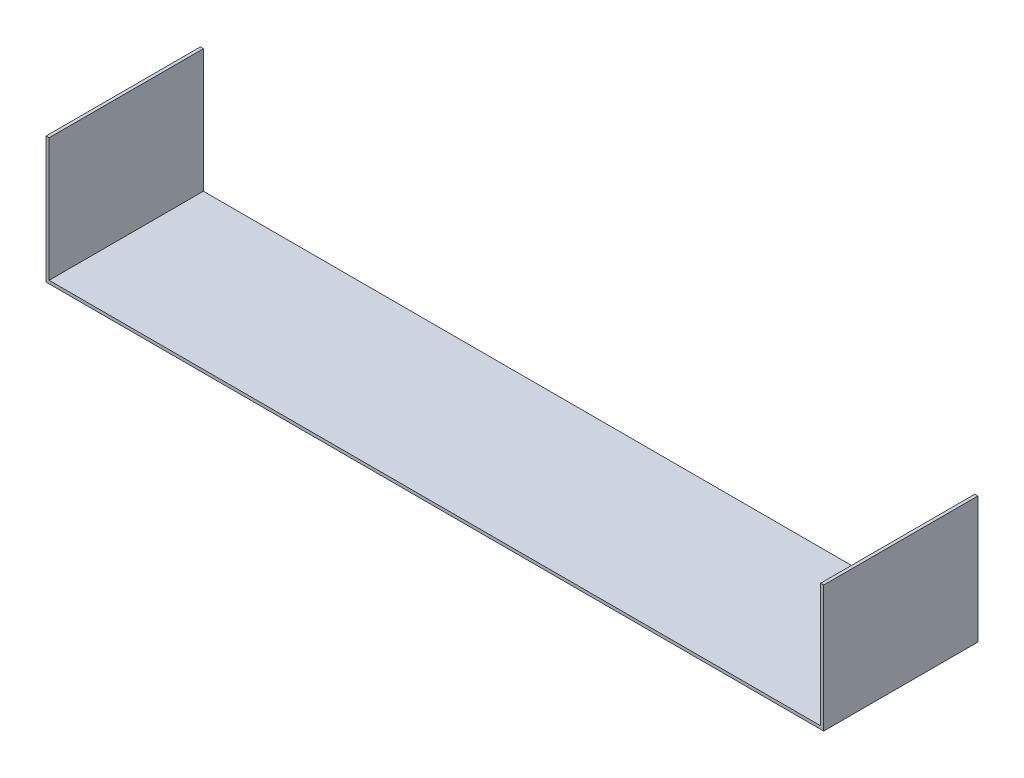
ISO-10303-21;
HEADER;
FILE_DESCRIPTION(('STEP AP214'),'2;1');
FILE_NAME('part.step','',(''),(''),'','','');
FILE_SCHEMA(('AUTOMOTIVE_DESIGN { 1 0 10303 214 1 1 1 1 }'));
ENDSEC;
DATA;
#1=APPLICATION_CONTEXT('core data for automotive mechanical design processes');
#2=APPLICATION_PROTOCOL_DEFINITION('international standard','automotive_design',2000,#1);
#3=PRODUCT_CONTEXT('',#1,'mechanical');
#4=PRODUCT('Part','Part','',(#3));
#5=PRODUCT_RELATED_PRODUCT_CATEGORY('part','',(#4));
#6=PRODUCT_DEFINITION_FORMATION('','',#4);
#7=PRODUCT_DEFINITION_CONTEXT('part definition',#1,'design');
#8=PRODUCT_DEFINITION('design','',#6,#7);
#9=PRODUCT_DEFINITION_SHAPE('','',#8);
#10=(LENGTH_UNIT() NAMED_UNIT(*) SI_UNIT(.MILLI.,.METRE.));
#11=(NAMED_UNIT(*) PLANE_ANGLE_UNIT() SI_UNIT($,.RADIAN.));
#12=(NAMED_UNIT(*) SI_UNIT($,.STERADIAN.) SOLID_ANGLE_UNIT());
#13=UNCERTAINTY_MEASURE_WITH_UNIT(LENGTH_MEASURE(1.E-05),#10,'distance_accuracy_value','');
#14=(GEOMETRIC_REPRESENTATION_CONTEXT(3) GLOBAL_UNCERTAINTY_ASSIGNED_CONTEXT((#13)) GLOBAL_UNIT_ASSIGNED_CONTEXT((#10,
#11,#12)) REPRESENTATION_CONTEXT('',''));
#15=CARTESIAN_POINT('',(0.,0.,0.));
#16=DIRECTION('',(0.,0.,1.));
#17=DIRECTION('',(1.,0.,0.));
#18=AXIS2_PLACEMENT_3D('',#15,#16,#17);
#19=CARTESIAN_POINT('',(-200.,0.,-10000.));
#20=DIRECTION('',(0.,1.,0.));
#21=DIRECTION('',(0.,0.,1.));
#22=AXIS2_PLACEMENT_3D('',#19,#20,#21);
#23=PLANE('',#22);
#24=DIRECTION('',(-1.,0.,0.));
#25=VECTOR('',#24,1.);
#26=CARTESIAN_POINT('',(-200.,0.,0.));
#27=LINE('',#26,#25);
#28=CARTESIAN_POINT('',(0.,0.,0.));
#29=VERTEX_POINT('',#28);
#30=CARTESIAN_POINT('',(-200.,0.,0.));
#31=VERTEX_POINT('',#30);
#32=EDGE_CURVE('E138',#29,#31,#27,.T.);
#33=ORIENTED_EDGE('',*,*,#32,.F.);
#34=DIRECTION('',(0.,0.,1.));
#35=VECTOR('',#34,1.);
#36=CARTESIAN_POINT('',(0.,0.,-10000.));
#37=LINE('',#36,#35);
#38=CARTESIAN_POINT('',(0.,0.,-10000.));
#39=VERTEX_POINT('',#38);
#40=EDGE_CURVE('E11',#39,#29,#37,.T.);
#41=ORIENTED_EDGE('',*,*,#40,.F.);
#42=DIRECTION('',(-1.,0.,0.));
#43=VECTOR('',#42,1.);
#44=CARTESIAN_POINT('',(-200.,0.,-10000.));
#45=LINE('',#44,#43);
#46=CARTESIAN_POINT('',(-200.,0.,-10000.));
#47=VERTEX_POINT('',#46);
#48=EDGE_CURVE('E158',#39,#47,#45,.T.);
#49=ORIENTED_EDGE('',*,*,#48,.T.);
#50=DIRECTION('',(0.,0.,1.));
#51=VECTOR('',#50,1.);
#52=CARTESIAN_POINT('',(-200.,0.,-10000.));
#53=LINE('',#52,#51);
#54=EDGE_CURVE('E44',#47,#31,#53,.T.);
#55=ORIENTED_EDGE('',*,*,#54,.T.);
#56=EDGE_LOOP('',(#33,#41,#49,#55));
#57=FACE_BOUND('',#56,.T.);
#58=ADVANCED_FACE('F41',(#57),#23,.T.);
#59=CARTESIAN_POINT('',(0.,0.,-10000.));
#60=DIRECTION('',(1.,0.,0.));
#61=DIRECTION('',(0.,1.,0.));
#62=AXIS2_PLACEMENT_3D('',#59,#60,#61);
#63=PLANE('',#62);
#64=DIRECTION('',(0.,1.,0.));
#65=VECTOR('',#64,1.);
#66=CARTESIAN_POINT('',(0.,0.,0.));
#67=LINE('',#66,#65);
#68=CARTESIAN_POINT('',(9.79717439317883E-13,-8000.,0.));
#69=VERTEX_POINT('',#68);
#70=EDGE_CURVE('E156',#69,#29,#67,.T.);
#71=ORIENTED_EDGE('',*,*,#70,.F.);
#72=DIRECTION('',(0.,0.,1.));
#73=VECTOR('',#72,1.);
#74=CARTESIAN_POINT('',(9.79717439317883E-13,-8000.,-10000.));
#75=LINE('',#74,#73);
#76=CARTESIAN_POINT('',(9.79717439317883E-13,-8000.,-10000.));
#77=VERTEX_POINT('',#76);
#78=EDGE_CURVE('E50',#77,#69,#75,.T.);
#79=ORIENTED_EDGE('',*,*,#78,.F.);
#80=DIRECTION('',(0.,1.,0.));
#81=VECTOR('',#80,1.);
#82=CARTESIAN_POINT('',(0.,0.,-10000.));
#83=LINE('',#82,#81);
#84=EDGE_CURVE('E128',#77,#39,#83,.T.);
#85=ORIENTED_EDGE('',*,*,#84,.T.);
#86=ORIENTED_EDGE('',*,*,#40,.T.);
#87=EDGE_LOOP('',(#71,#79,#85,#86));
#88=FACE_BOUND('',#87,.T.);
#89=ADVANCED_FACE('F170',(#88),#63,.T.);
#90=CARTESIAN_POINT('',(9.79717439317883E-13,-8000.,-10000.));
#91=DIRECTION('',(0.,1.,0.));
#92=DIRECTION('',(0.,0.,1.));
#93=AXIS2_PLACEMENT_3D('',#90,#91,#92);
#94=PLANE('',#93);
#95=DIRECTION('',(-1.,0.,0.));
#96=VECTOR('',#95,1.);
#97=CARTESIAN_POINT('',(9.79717439317883E-13,-8000.,0.));
#98=LINE('',#97,#96);
#99=CARTESIAN_POINT('',(50000.,-8000.,0.));
#100=VERTEX_POINT('',#99);
#101=EDGE_CURVE('E115',#100,#69,#98,.T.);
#102=ORIENTED_EDGE('',*,*,#101,.F.);
#103=DIRECTION('',(0.,0.,1.));
#104=VECTOR('',#103,1.);
#105=CARTESIAN_POINT('',(50000.,-8000.,-10000.));
#106=LINE('',#105,#104);
#107=CARTESIAN_POINT('',(50000.,-8000.,-10000.));
#108=VERTEX_POINT('',#107);
#109=EDGE_CURVE('E110',#108,#100,#106,.T.);
#110=ORIENTED_EDGE('',*,*,#109,.F.);
#111=DIRECTION('',(-1.,0.,0.));
#112=VECTOR('',#111,1.);
#113=CARTESIAN_POINT('',(9.79717439317883E-13,-8000.,-10000.));
#114=LINE('',#113,#112);
#115=EDGE_CURVE('E113',#108,#77,#114,.T.);
#116=ORIENTED_EDGE('',*,*,#115,.T.);
#117=ORIENTED_EDGE('',*,*,#78,.T.);
#118=EDGE_LOOP('',(#102,#110,#116,#117));
#119=FACE_BOUND('',#118,.T.);
#120=ADVANCED_FACE('F112',(#119),#94,.T.);
#121=CARTESIAN_POINT('',(50000.,-8000.,-10000.));
#122=DIRECTION('',(-1.,0.,0.));
#123=DIRECTION('',(0.,0.,1.));
#124=AXIS2_PLACEMENT_3D('',#121,#122,#123);
#125=PLANE('',#124);
#126=DIRECTION('',(0.,-1.,0.));
#127=VECTOR('',#126,1.);
#128=CARTESIAN_POINT('',(50000.,-8000.,0.));
#129=LINE('',#128,#127);
#130=CARTESIAN_POINT('',(50000.,0.,0.));
#131=VERTEX_POINT('',#130);
#132=EDGE_CURVE('E153',#131,#100,#129,.T.);
#133=ORIENTED_EDGE('',*,*,#132,.F.);
#134=DIRECTION('',(0.,0.,1.));
#135=VECTOR('',#134,1.);
#136=CARTESIAN_POINT('',(50000.,0.,-10000.));
#137=LINE('',#136,#135);
#138=CARTESIAN_POINT('',(50000.,0.,-10000.));
#139=VERTEX_POINT('',#138);
#140=EDGE_CURVE('E120',#139,#131,#137,.T.);
#141=ORIENTED_EDGE('',*,*,#140,.F.);
#142=DIRECTION('',(0.,-1.,0.));
#143=VECTOR('',#142,1.);
#144=CARTESIAN_POINT('',(50000.,-8000.,-10000.));
#145=LINE('',#144,#143);
#146=EDGE_CURVE('E126',#139,#108,#145,.T.);
#147=ORIENTED_EDGE('',*,*,#146,.T.);
#148=ORIENTED_EDGE('',*,*,#109,.T.);
#149=EDGE_LOOP('',(#133,#141,#147,#148));
#150=FACE_BOUND('',#149,.T.);
#151=ADVANCED_FACE('F130',(#150),#125,.T.);
#152=CARTESIAN_POINT('',(50000.,0.,-10000.));
#153=DIRECTION('',(0.,1.,0.));
#154=DIRECTION('',(0.,0.,1.));
#155=AXIS2_PLACEMENT_3D('',#152,#153,#154);
#156=PLANE('',#155);
#157=DIRECTION('',(-1.,0.,0.));
#158=VECTOR('',#157,1.);
#159=CARTESIAN_POINT('',(50000.,0.,0.));
#160=LINE('',#159,#158);
#161=CARTESIAN_POINT('',(50200.,0.,0.));
#162=VERTEX_POINT('',#161);
#163=EDGE_CURVE('E150',#162,#131,#160,.T.);
#164=ORIENTED_EDGE('',*,*,#163,.F.);
#165=DIRECTION('',(0.,0.,1.));
#166=VECTOR('',#165,1.);
#167=CARTESIAN_POINT('',(50200.,0.,-10000.));
#168=LINE('',#167,#166);
#169=CARTESIAN_POINT('',(50200.,0.,-10000.));
#170=VERTEX_POINT('',#169);
#171=EDGE_CURVE('E162',#170,#162,#168,.T.);
#172=ORIENTED_EDGE('',*,*,#171,.F.);
#173=DIRECTION('',(-1.,0.,0.));
#174=VECTOR('',#173,1.);
#175=CARTESIAN_POINT('',(50000.,0.,-10000.));
#176=LINE('',#175,#174);
#177=EDGE_CURVE('E131',#170,#139,#176,.T.);
#178=ORIENTED_EDGE('',*,*,#177,.T.);
#179=ORIENTED_EDGE('',*,*,#140,.T.);
#180=EDGE_LOOP('',(#164,#172,#178,#179));
#181=FACE_BOUND('',#180,.T.);
#182=ADVANCED_FACE('F183',(#181),#156,.T.);
#183=CARTESIAN_POINT('',(50200.,-8200.,-10000.));
#184=DIRECTION('',(1.,0.,0.));
#185=DIRECTION('',(0.,0.,-1.));
#186=AXIS2_PLACEMENT_3D('',#183,#184,#185);
#187=PLANE('',#186);
#188=DIRECTION('',(0.,1.,0.));
#189=VECTOR('',#188,1.);
#190=CARTESIAN_POINT('',(50200.,-8200.,0.));
#191=LINE('',#190,#189);
#192=CARTESIAN_POINT('',(50200.,-8200.,0.));
#193=VERTEX_POINT('',#192);
#194=EDGE_CURVE('E147',#193,#162,#191,.T.);
#195=ORIENTED_EDGE('',*,*,#194,.F.);
#196=DIRECTION('',(0.,0.,1.));
#197=VECTOR('',#196,1.);
#198=CARTESIAN_POINT('',(50200.,-8200.,-10000.));
#199=LINE('',#198,#197);
#200=CARTESIAN_POINT('',(50200.,-8200.,-10000.));
#201=VERTEX_POINT('',#200);
#202=EDGE_CURVE('E164',#201,#193,#199,.T.);
#203=ORIENTED_EDGE('',*,*,#202,.F.);
#204=DIRECTION('',(0.,1.,0.));
#205=VECTOR('',#204,1.);
#206=CARTESIAN_POINT('',(50200.,-8200.,-10000.));
#207=LINE('',#206,#205);
#208=EDGE_CURVE('E133',#201,#170,#207,.T.);
#209=ORIENTED_EDGE('',*,*,#208,.T.);
#210=ORIENTED_EDGE('',*,*,#171,.T.);
#211=EDGE_LOOP('',(#195,#203,#209,#210));
#212=FACE_BOUND('',#211,.T.);
#213=ADVANCED_FACE('F186',(#212),#187,.T.);
#214=CARTESIAN_POINT('',(-199.999999999998,-8200.,-10000.));
#215=DIRECTION('',(0.,-1.,0.));
#216=DIRECTION('',(1.,0.,0.));
#217=AXIS2_PLACEMENT_3D('',#214,#215,#216);
#218=PLANE('',#217);
#219=DIRECTION('',(1.,0.,0.));
#220=VECTOR('',#219,1.);
#221=CARTESIAN_POINT('',(-199.999999999998,-8200.,0.));
#222=LINE('',#221,#220);
#223=CARTESIAN_POINT('',(-199.999999999998,-8200.,0.));
#224=VERTEX_POINT('',#223);
#225=EDGE_CURVE('E144',#224,#193,#222,.T.);
#226=ORIENTED_EDGE('',*,*,#225,.F.);
#227=DIRECTION('',(0.,0.,1.));
#228=VECTOR('',#227,1.);
#229=CARTESIAN_POINT('',(-199.999999999998,-8200.,-10000.));
#230=LINE('',#229,#228);
#231=CARTESIAN_POINT('',(-199.999999999998,-8200.,-10000.));
#232=VERTEX_POINT('',#231);
#233=EDGE_CURVE('E165',#232,#224,#230,.T.);
#234=ORIENTED_EDGE('',*,*,#233,.F.);
#235=DIRECTION('',(1.,0.,0.));
#236=VECTOR('',#235,1.);
#237=CARTESIAN_POINT('',(-199.999999999998,-8200.,-10000.));
#238=LINE('',#237,#236);
#239=EDGE_CURVE('E281',#232,#201,#238,.T.);
#240=ORIENTED_EDGE('',*,*,#239,.T.);
#241=ORIENTED_EDGE('',*,*,#202,.T.);
#242=EDGE_LOOP('',(#226,#234,#240,#241));
#243=FACE_BOUND('',#242,.T.);
#244=ADVANCED_FACE('F190',(#243),#218,.T.);
#245=CARTESIAN_POINT('',(-200.,0.,-10000.));
#246=DIRECTION('',(-1.,0.,0.));
#247=DIRECTION('',(0.,-1.,0.));
#248=AXIS2_PLACEMENT_3D('',#245,#246,#247);
#249=PLANE('',#248);
#250=DIRECTION('',(0.,-1.,0.));
#251=VECTOR('',#250,1.);
#252=CARTESIAN_POINT('',(-200.,0.,0.));
#253=LINE('',#252,#251);
#254=EDGE_CURVE('E141',#31,#224,#253,.T.);
#255=ORIENTED_EDGE('',*,*,#254,.F.);
#256=ORIENTED_EDGE('',*,*,#54,.F.);
#257=DIRECTION('',(0.,-1.,0.));
#258=VECTOR('',#257,1.);
#259=CARTESIAN_POINT('',(-200.,0.,-10000.));
#260=LINE('',#259,#258);
#261=EDGE_CURVE('E282',#47,#232,#260,.T.);
#262=ORIENTED_EDGE('',*,*,#261,.T.);
#263=ORIENTED_EDGE('',*,*,#233,.T.);
#264=EDGE_LOOP('',(#255,#256,#262,#263));
#265=FACE_BOUND('',#264,.T.);
#266=ADVANCED_FACE('F167',(#265),#249,.T.);
#267=CARTESIAN_POINT('',(0.,0.,-10000.));
#268=DIRECTION('',(0.,0.,-1.));
#269=DIRECTION('',(-1.,0.,0.));
#270=AXIS2_PLACEMENT_3D('',#267,#268,#269);
#271=PLANE('',#270);
#272=ORIENTED_EDGE('',*,*,#48,.F.);
#273=ORIENTED_EDGE('',*,*,#84,.F.);
#274=ORIENTED_EDGE('',*,*,#115,.F.);
#275=ORIENTED_EDGE('',*,*,#146,.F.);
#276=ORIENTED_EDGE('',*,*,#177,.F.);
#277=ORIENTED_EDGE('',*,*,#208,.F.);
#278=ORIENTED_EDGE('',*,*,#239,.F.);
#279=ORIENTED_EDGE('',*,*,#261,.F.);
#280=EDGE_LOOP('',(#272,#273,#274,#275,#276,#277,#278,#279));
#281=FACE_BOUND('',#280,.T.);
#282=ADVANCED_FACE('F124',(#281),#271,.T.);
#283=CARTESIAN_POINT('',(0.,0.,0.));
#284=DIRECTION('',(0.,0.,-1.));
#285=DIRECTION('',(-1.,0.,0.));
#286=AXIS2_PLACEMENT_3D('',#283,#284,#285);
#287=PLANE('',#286);
#288=ORIENTED_EDGE('',*,*,#32,.T.);
#289=ORIENTED_EDGE('',*,*,#254,.T.);
#290=ORIENTED_EDGE('',*,*,#225,.T.);
#291=ORIENTED_EDGE('',*,*,#194,.T.);
#292=ORIENTED_EDGE('',*,*,#163,.T.);
#293=ORIENTED_EDGE('',*,*,#132,.T.);
#294=ORIENTED_EDGE('',*,*,#101,.T.);
#295=ORIENTED_EDGE('',*,*,#70,.T.);
#296=EDGE_LOOP('',(#288,#289,#290,#291,#292,#293,#294,#295));
#297=FACE_BOUND('',#296,.T.);
#298=ADVANCED_FACE('F169',(#297),#287,.F.);
#299=CLOSED_SHELL('',(#58,#89,#120,#151,#182,#213,#244,#266,#282,#298));
#300=MANIFOLD_SOLID_BREP('B2',#299);
#301=ADVANCED_BREP_SHAPE_REPRESENTATION('',(#18,#300),#14);
#302=SHAPE_DEFINITION_REPRESENTATION(#9,#301);
ENDSEC;
END-ISO-10303-21;
